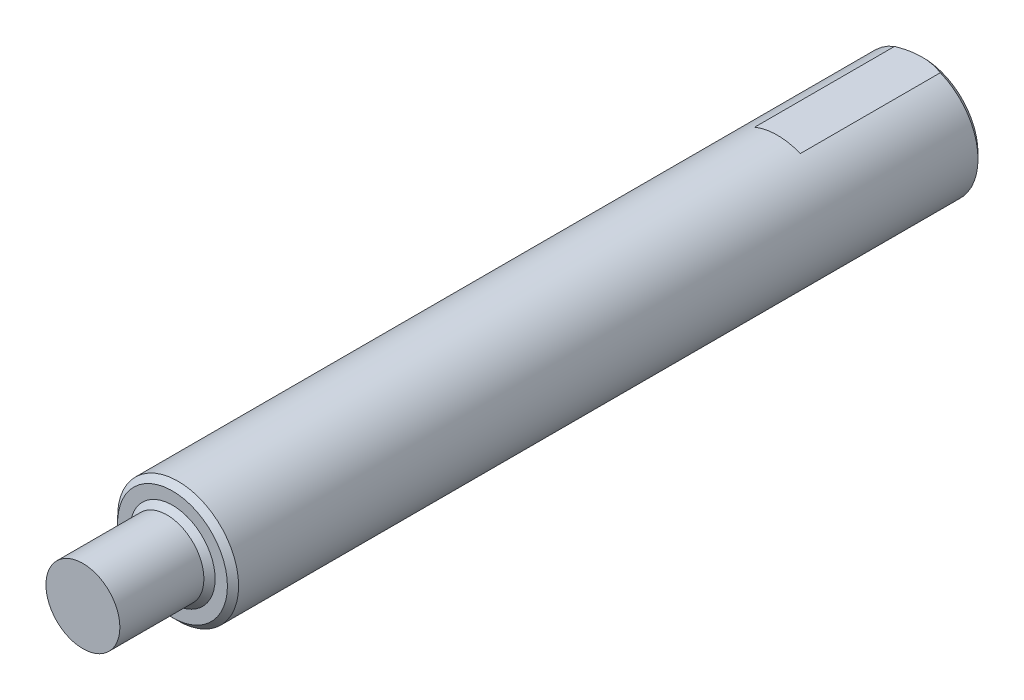
ISO-10303-21;
HEADER;
FILE_DESCRIPTION(('STEP AP214'),'2;1');
FILE_NAME('part.step','',(''),(''),'','','');
FILE_SCHEMA(('AUTOMOTIVE_DESIGN { 1 0 10303 214 1 1 1 1 }'));
ENDSEC;
DATA;
#1=APPLICATION_CONTEXT('core data for automotive mechanical design processes');
#2=APPLICATION_PROTOCOL_DEFINITION('international standard','automotive_design',2000,#1);
#3=PRODUCT_CONTEXT('',#1,'mechanical');
#4=PRODUCT('Part','Part','',(#3));
#5=PRODUCT_RELATED_PRODUCT_CATEGORY('part','',(#4));
#6=PRODUCT_DEFINITION_FORMATION('','',#4);
#7=PRODUCT_DEFINITION_CONTEXT('part definition',#1,'design');
#8=PRODUCT_DEFINITION('design','',#6,#7);
#9=PRODUCT_DEFINITION_SHAPE('','',#8);
#10=(LENGTH_UNIT() NAMED_UNIT(*) SI_UNIT(.MILLI.,.METRE.));
#11=(NAMED_UNIT(*) PLANE_ANGLE_UNIT() SI_UNIT($,.RADIAN.));
#12=(NAMED_UNIT(*) SI_UNIT($,.STERADIAN.) SOLID_ANGLE_UNIT());
#13=UNCERTAINTY_MEASURE_WITH_UNIT(LENGTH_MEASURE(1.E-05),#10,'distance_accuracy_value','');
#14=(GEOMETRIC_REPRESENTATION_CONTEXT(3) GLOBAL_UNCERTAINTY_ASSIGNED_CONTEXT((#13)) GLOBAL_UNIT_ASSIGNED_CONTEXT((#10,
#11,#12)) REPRESENTATION_CONTEXT('',''));
#15=CARTESIAN_POINT('',(0.,0.,0.));
#16=DIRECTION('',(0.,0.,1.));
#17=DIRECTION('',(1.,0.,0.));
#18=AXIS2_PLACEMENT_3D('',#15,#16,#17);
#19=CARTESIAN_POINT('',(0.,0.,67.));
#20=DIRECTION('',(0.,0.,-1.));
#21=DIRECTION('',(-1.,0.,0.));
#22=AXIS2_PLACEMENT_3D('',#19,#20,#21);
#23=CYLINDRICAL_SURFACE('',#22,5.4);
#24=CARTESIAN_POINT('',(0.,0.,66.5));
#25=DIRECTION('',(0.,0.,1.));
#26=DIRECTION('',(1.,0.,0.));
#27=AXIS2_PLACEMENT_3D('',#24,#25,#26);
#28=CIRCLE('',#27,5.4);
#29=CARTESIAN_POINT('',(5.4,0.,66.5));
#30=VERTEX_POINT('',#29);
#31=EDGE_CURVE('E114',#30,#30,#28,.F.);
#32=ORIENTED_EDGE('',*,*,#31,.T.);
#33=EDGE_LOOP('',(#32));
#34=FACE_BOUND('',#33,.T.);
#35=CARTESIAN_POINT('',(0.,0.,13.));
#36=DIRECTION('',(0.,0.,1.));
#37=DIRECTION('',(1.,0.,0.));
#38=AXIS2_PLACEMENT_3D('',#35,#36,#37);
#39=CIRCLE('',#38,5.4);
#40=CARTESIAN_POINT('',(-2.03960780543711,-5.,13.));
#41=VERTEX_POINT('',#40);
#42=CARTESIAN_POINT('',(2.03960780543711,-5.,13.));
#43=VERTEX_POINT('',#42);
#44=EDGE_CURVE('E86',#41,#43,#39,.T.);
#45=ORIENTED_EDGE('',*,*,#44,.T.);
#46=DIRECTION('',(0.,0.,-1.));
#47=VECTOR('',#46,1.);
#48=CARTESIAN_POINT('',(2.03960780543712,-5.,67.));
#49=LINE('',#48,#47);
#50=CARTESIAN_POINT('',(2.03960780543711,-5.,0.500000000000001));
#51=VERTEX_POINT('',#50);
#52=EDGE_CURVE('E92',#43,#51,#49,.T.);
#53=ORIENTED_EDGE('',*,*,#52,.T.);
#54=CARTESIAN_POINT('',(0.,0.,0.5));
#55=DIRECTION('',(0.,0.,1.));
#56=DIRECTION('',(1.,0.,0.));
#57=AXIS2_PLACEMENT_3D('',#54,#55,#56);
#58=CIRCLE('',#57,5.4);
#59=CARTESIAN_POINT('',(2.03960780543711,5.,0.5));
#60=VERTEX_POINT('',#59);
#61=EDGE_CURVE('E62',#51,#60,#58,.T.);
#62=ORIENTED_EDGE('',*,*,#61,.T.);
#63=DIRECTION('',(0.,0.,-1.));
#64=VECTOR('',#63,1.);
#65=CARTESIAN_POINT('',(2.03960780543712,5.,67.));
#66=LINE('',#65,#64);
#67=CARTESIAN_POINT('',(2.03960780543711,5.,13.));
#68=VERTEX_POINT('',#67);
#69=EDGE_CURVE('E106',#68,#60,#66,.T.);
#70=ORIENTED_EDGE('',*,*,#69,.F.);
#71=CARTESIAN_POINT('',(0.,0.,13.));
#72=DIRECTION('',(0.,0.,1.));
#73=DIRECTION('',(1.,0.,0.));
#74=AXIS2_PLACEMENT_3D('',#71,#72,#73);
#75=CIRCLE('',#74,5.4);
#76=CARTESIAN_POINT('',(-2.03960780543711,5.,13.));
#77=VERTEX_POINT('',#76);
#78=EDGE_CURVE('E139',#68,#77,#75,.T.);
#79=ORIENTED_EDGE('',*,*,#78,.T.);
#80=DIRECTION('',(0.,0.,-1.));
#81=VECTOR('',#80,1.);
#82=CARTESIAN_POINT('',(-2.03960780543712,5.,67.));
#83=LINE('',#82,#81);
#84=CARTESIAN_POINT('',(-2.03960780543711,5.,0.500000000000001));
#85=VERTEX_POINT('',#84);
#86=EDGE_CURVE('E104',#85,#77,#83,.F.);
#87=ORIENTED_EDGE('',*,*,#86,.F.);
#88=CARTESIAN_POINT('',(-2.03960780543711,-5.,0.5));
#89=VERTEX_POINT('',#88);
#90=EDGE_CURVE('E97',#85,#89,#58,.T.);
#91=ORIENTED_EDGE('',*,*,#90,.T.);
#92=DIRECTION('',(0.,0.,-1.));
#93=VECTOR('',#92,1.);
#94=CARTESIAN_POINT('',(-2.03960780543712,-5.,67.));
#95=LINE('',#94,#93);
#96=EDGE_CURVE('E54',#89,#41,#95,.F.);
#97=ORIENTED_EDGE('',*,*,#96,.T.);
#98=EDGE_LOOP('',(#45,#53,#62,#70,#79,#87,#91,#97));
#99=FACE_BOUND('',#98,.T.);
#100=ADVANCED_FACE('F39',(#34,#99),#23,.T.);
#101=CARTESIAN_POINT('',(0.,0.,0.5));
#102=DIRECTION('',(0.,0.,1.));
#103=DIRECTION('',(1.,0.,0.));
#104=AXIS2_PLACEMENT_3D('',#101,#102,#103);
#105=CONICAL_SURFACE('',#104,5.4,0.785398163397454);
#106=CARTESIAN_POINT('',(-3.55844793750584,-5.,1.23698229783494));
#107=CARTESIAN_POINT('',(-3.46862853281631,-5.,1.18490731578521));
#108=CARTESIAN_POINT('',(-3.37824708377923,-5.,1.13380360024076));
#109=CARTESIAN_POINT('',(-3.19623728614933,-5.,1.03381290104911));
#110=CARTESIAN_POINT('',(-3.10460862260932,-5.,0.984926491343643));
#111=CARTESIAN_POINT('',(-2.82702617390309,-5.,0.84167734532322));
#112=CARTESIAN_POINT('',(-2.63906658882333,-5.,0.75113053636076));
#113=CARTESIAN_POINT('',(-2.25426955084791,-5.,0.581916277053989));
#114=CARTESIAN_POINT('',(-2.05733888313538,-5.,0.503458458257276));
#115=CARTESIAN_POINT('',(-1.65751480131661,-5.,0.364256266708926));
#116=CARTESIAN_POINT('',(-1.4546319649387,-5.,0.303482344961021));
#117=CARTESIAN_POINT('',(-1.1246661128785,-5.,0.223502518929506));
#118=CARTESIAN_POINT('',(-0.999254136032923,-5.,0.197356244040855));
#119=CARTESIAN_POINT('',(-0.7468715711558,-5.,0.153946873610008));
#120=CARTESIAN_POINT('',(-0.619900907762321,-5.,0.136684209332923));
#121=CARTESIAN_POINT('',(-0.366074762066633,-5.,0.111805570168606));
#122=CARTESIAN_POINT('',(-0.239227094519324,-5.,0.104110605508209));
#123=CARTESIAN_POINT('',(0.0146882198085537,-5.,0.0984099621337332));
#124=CARTESIAN_POINT('',(0.141755871556905,-5.,0.100404505162543));
#125=CARTESIAN_POINT('',(0.414831894586559,-5.,0.115054400963581));
#126=CARTESIAN_POINT('',(0.560756443216524,-5.,0.129297800581304));
#127=CARTESIAN_POINT('',(0.850917867372856,-5.,0.169851883898826));
#128=CARTESIAN_POINT('',(0.995154397995772,-5.,0.196164991066865));
#129=CARTESIAN_POINT('',(1.28296336382972,-5.,0.260043725859941));
#130=CARTESIAN_POINT('',(1.42650538133625,-5.,0.297744851612287));
#131=CARTESIAN_POINT('',(1.71063388042911,-5.,0.382791524768694));
#132=CARTESIAN_POINT('',(1.85122096385269,-5.,0.430135086862981));
#133=CARTESIAN_POINT('',(2.17064155139047,-5.,0.548264489050556));
#134=CARTESIAN_POINT('',(2.34843963453479,-5.,0.62183722243253));
#135=CARTESIAN_POINT('',(2.69916966120003,-5.,0.779875127886671));
#136=CARTESIAN_POINT('',(2.87209891120536,-5.,0.864346190248952));
#137=CARTESIAN_POINT('',(3.2140915752397,-5.,1.04213553536569));
#138=CARTESIAN_POINT('',(3.38313912228285,-5.,1.13548410277971));
#139=CARTESIAN_POINT('',(3.71726244007848,-5.,1.32892384637747));
#140=CARTESIAN_POINT('',(3.88233894061287,-5.,1.42901377061601));
#141=CARTESIAN_POINT('',(4.20141944792188,-5.,1.62972307247471));
#142=CARTESIAN_POINT('',(4.35557911866465,-5.,1.73009626769987));
#143=CARTESIAN_POINT('',(4.66125946164198,-5.,1.93479801264585));
#144=CARTESIAN_POINT('',(4.81277991763847,-5.,2.03912688426204));
#145=CARTESIAN_POINT('',(5.11224654466357,-5.,2.25009416663372));
#146=CARTESIAN_POINT('',(5.26021226580976,-5.,2.35670492382208));
#147=CARTESIAN_POINT('',(5.5541632941286,-5.,2.57254212643726));
#148=CARTESIAN_POINT('',(5.7001491331678,-5.,2.68176784668037));
#149=CARTESIAN_POINT('',(5.84531484286481,-5.,2.79205470678773));
#150=B_SPLINE_CURVE_WITH_KNOTS('',3,(#106,#107,#108,#109,#110,#111,#112,#113,#114,#115,#116,
#117,#118,#119,#120,#121,#122,#123,#124,#125,#126,#127,#128,#129,#130,#131,#132,#133,#134,#135,
#136,#137,#138,#139,#140,#141,#142,#143,#144,#145,#146,#147,#148,#149),.UNSPECIFIED.,.F.,.F.,(4,
2,2,2,2,2,2,2,2,2,2,2,2,2,2,2,2,2,2,2,2,4),(0.,0.311458707648843,0.622997580473996,
1.24847571868561,1.88380812576863,2.51807274309483,2.90212477400918,3.28619544741344,
3.66707375996796,4.04796078890493,4.48726123245071,4.92664992146678,5.37148755985962,
5.81623370173474,6.39300615892292,6.97009166426407,7.54922173529127,8.12824455037756,
8.6800416751172,9.23188379943474,9.778969951991,10.3259061044888),.UNSPECIFIED.);
#151=EDGE_CURVE('E89',#89,#51,#150,.T.);
#152=ORIENTED_EDGE('',*,*,#151,.F.);
#153=ORIENTED_EDGE('',*,*,#90,.F.);
#154=CARTESIAN_POINT('',(-3.55844793750584,5.,1.23698229783494));
#155=CARTESIAN_POINT('',(-3.46862853281631,5.,1.18490731578521));
#156=CARTESIAN_POINT('',(-3.37824708377923,5.,1.13380360024076));
#157=CARTESIAN_POINT('',(-3.19623728614933,5.,1.03381290104911));
#158=CARTESIAN_POINT('',(-3.10460862260932,5.,0.984926491343643));
#159=CARTESIAN_POINT('',(-2.82702617390309,5.,0.84167734532322));
#160=CARTESIAN_POINT('',(-2.63906658882333,5.,0.75113053636076));
#161=CARTESIAN_POINT('',(-2.25426955084791,5.,0.581916277053989));
#162=CARTESIAN_POINT('',(-2.05733888313538,5.,0.503458458257276));
#163=CARTESIAN_POINT('',(-1.65751480131661,5.,0.364256266708926));
#164=CARTESIAN_POINT('',(-1.4546319649387,5.,0.303482344961021));
#165=CARTESIAN_POINT('',(-1.1246661128785,5.,0.223502518929506));
#166=CARTESIAN_POINT('',(-0.999254136032923,5.,0.197356244040855));
#167=CARTESIAN_POINT('',(-0.7468715711558,5.,0.153946873610008));
#168=CARTESIAN_POINT('',(-0.619900907762321,5.,0.136684209332923));
#169=CARTESIAN_POINT('',(-0.366074762066633,5.,0.111805570168606));
#170=CARTESIAN_POINT('',(-0.239227094519324,5.,0.104110605508209));
#171=CARTESIAN_POINT('',(0.0146882198085537,5.,0.0984099621337332));
#172=CARTESIAN_POINT('',(0.141755871556905,5.,0.100404505162543));
#173=CARTESIAN_POINT('',(0.414831894586559,5.,0.115054400963581));
#174=CARTESIAN_POINT('',(0.560756443216524,5.,0.129297800581304));
#175=CARTESIAN_POINT('',(0.850917867372856,5.,0.169851883898826));
#176=CARTESIAN_POINT('',(0.995154397995772,5.,0.196164991066865));
#177=CARTESIAN_POINT('',(1.28296336382972,5.,0.260043725859941));
#178=CARTESIAN_POINT('',(1.42650538133625,5.,0.297744851612287));
#179=CARTESIAN_POINT('',(1.71063388042911,5.,0.382791524768694));
#180=CARTESIAN_POINT('',(1.85122096385269,5.,0.430135086862981));
#181=CARTESIAN_POINT('',(2.17064155139047,5.,0.548264489050556));
#182=CARTESIAN_POINT('',(2.34843963453479,5.,0.62183722243253));
#183=CARTESIAN_POINT('',(2.69916966120003,5.,0.779875127886671));
#184=CARTESIAN_POINT('',(2.87209891120536,5.,0.864346190248952));
#185=CARTESIAN_POINT('',(3.2140915752397,5.,1.04213553536569));
#186=CARTESIAN_POINT('',(3.38313912228285,5.,1.13548410277971));
#187=CARTESIAN_POINT('',(3.71726244007848,5.,1.32892384637747));
#188=CARTESIAN_POINT('',(3.88233894061287,5.,1.42901377061601));
#189=CARTESIAN_POINT('',(4.20141944792188,5.,1.62972307247471));
#190=CARTESIAN_POINT('',(4.35557911866465,5.,1.73009626769987));
#191=CARTESIAN_POINT('',(4.66125946164198,5.,1.93479801264585));
#192=CARTESIAN_POINT('',(4.81277991763847,5.,2.03912688426204));
#193=CARTESIAN_POINT('',(5.11224654466357,5.,2.25009416663372));
#194=CARTESIAN_POINT('',(5.26021226580976,5.,2.35670492382208));
#195=CARTESIAN_POINT('',(5.5541632941286,5.,2.57254212643726));
#196=CARTESIAN_POINT('',(5.7001491331678,5.,2.68176784668037));
#197=CARTESIAN_POINT('',(5.84531484286481,5.,2.79205470678773));
#198=B_SPLINE_CURVE_WITH_KNOTS('',3,(#154,#155,#156,#157,#158,#159,#160,#161,#162,#163,#164,
#165,#166,#167,#168,#169,#170,#171,#172,#173,#174,#175,#176,#177,#178,#179,#180,#181,#182,#183,
#184,#185,#186,#187,#188,#189,#190,#191,#192,#193,#194,#195,#196,#197),.UNSPECIFIED.,.F.,.F.,(4,
2,2,2,2,2,2,2,2,2,2,2,2,2,2,2,2,2,2,2,2,4),(0.,0.311458707648843,0.622997580473996,
1.24847571868561,1.88380812576863,2.51807274309483,2.90212477400918,3.28619544741344,
3.66707375996796,4.04796078890493,4.48726123245071,4.92664992146678,5.37148755985962,
5.81623370173474,6.39300615892292,6.97009166426407,7.54922173529127,8.12824455037756,
8.6800416751172,9.23188379943474,9.778969951991,10.3259061044888),.UNSPECIFIED.);
#199=EDGE_CURVE('E130',#85,#60,#198,.T.);
#200=ORIENTED_EDGE('',*,*,#199,.T.);
#201=ORIENTED_EDGE('',*,*,#61,.F.);
#202=EDGE_LOOP('',(#152,#153,#200,#201));
#203=FACE_BOUND('',#202,.T.);
#204=CARTESIAN_POINT('',(0.,0.,0.));
#205=DIRECTION('',(0.,0.,1.));
#206=DIRECTION('',(1.,0.,0.));
#207=AXIS2_PLACEMENT_3D('',#204,#205,#206);
#208=CIRCLE('',#207,4.9);
#209=CARTESIAN_POINT('',(4.9,0.,0.));
#210=VERTEX_POINT('',#209);
#211=EDGE_CURVE('E118',#210,#210,#208,.F.);
#212=ORIENTED_EDGE('',*,*,#211,.F.);
#213=EDGE_LOOP('',(#212));
#214=FACE_BOUND('',#213,.T.);
#215=ADVANCED_FACE('F141',(#203,#214),#105,.T.);
#216=CARTESIAN_POINT('',(0.,0.,67.));
#217=DIRECTION('',(0.,0.,1.));
#218=DIRECTION('',(1.,0.,0.));
#219=AXIS2_PLACEMENT_3D('',#216,#217,#218);
#220=PLANE('',#219);
#221=CARTESIAN_POINT('',(0.,0.,67.));
#222=DIRECTION('',(0.,0.,1.));
#223=DIRECTION('',(1.,0.,0.));
#224=AXIS2_PLACEMENT_3D('',#221,#222,#223);
#225=CIRCLE('',#224,3.79999999999999);
#226=CARTESIAN_POINT('',(3.79999999999999,0.,67.));
#227=VERTEX_POINT('',#226);
#228=EDGE_CURVE('E11',#227,#227,#225,.F.);
#229=ORIENTED_EDGE('',*,*,#228,.T.);
#230=EDGE_LOOP('',(#229));
#231=FACE_BOUND('',#230,.T.);
#232=CARTESIAN_POINT('',(0.,0.,67.));
#233=DIRECTION('',(0.,0.,1.));
#234=DIRECTION('',(1.,0.,0.));
#235=AXIS2_PLACEMENT_3D('',#232,#233,#234);
#236=CIRCLE('',#235,4.89999999999999);
#237=CARTESIAN_POINT('',(4.89999999999999,0.,67.));
#238=VERTEX_POINT('',#237);
#239=EDGE_CURVE('E121',#238,#238,#236,.T.);
#240=ORIENTED_EDGE('',*,*,#239,.T.);
#241=EDGE_LOOP('',(#240));
#242=FACE_BOUND('',#241,.T.);
#243=ADVANCED_FACE('F171',(#231,#242),#220,.T.);
#244=CARTESIAN_POINT('',(0.,0.,0.));
#245=DIRECTION('',(0.,0.,1.));
#246=DIRECTION('',(1.,0.,0.));
#247=AXIS2_PLACEMENT_3D('',#244,#245,#246);
#248=PLANE('',#247);
#249=CARTESIAN_POINT('',(0.,0.,0.));
#250=DIRECTION('',(0.,0.,1.));
#251=DIRECTION('',(1.,0.,0.));
#252=AXIS2_PLACEMENT_3D('',#249,#250,#251);
#253=CIRCLE('',#252,2.6);
#254=CARTESIAN_POINT('',(2.6,0.,0.));
#255=VERTEX_POINT('',#254);
#256=EDGE_CURVE('E127',#255,#255,#253,.T.);
#257=ORIENTED_EDGE('',*,*,#256,.T.);
#258=EDGE_LOOP('',(#257));
#259=FACE_BOUND('',#258,.T.);
#260=ORIENTED_EDGE('',*,*,#211,.T.);
#261=EDGE_LOOP('',(#260));
#262=FACE_BOUND('',#261,.T.);
#263=ADVANCED_FACE('F174',(#259,#262),#248,.F.);
#264=CARTESIAN_POINT('',(0.,0.,67.));
#265=DIRECTION('',(0.,0.,-1.));
#266=DIRECTION('',(-1.,0.,0.));
#267=AXIS2_PLACEMENT_3D('',#264,#265,#266);
#268=CONICAL_SURFACE('',#267,4.89999999999999,0.785398163397447);
#269=ORIENTED_EDGE('',*,*,#31,.F.);
#270=EDGE_LOOP('',(#269));
#271=FACE_BOUND('',#270,.T.);
#272=ORIENTED_EDGE('',*,*,#239,.F.);
#273=EDGE_LOOP('',(#272));
#274=FACE_BOUND('',#273,.T.);
#275=ADVANCED_FACE('F169',(#271,#274),#268,.T.);
#276=CARTESIAN_POINT('',(0.,0.,75.));
#277=DIRECTION('',(0.,0.,-1.));
#278=DIRECTION('',(-1.,0.,0.));
#279=AXIS2_PLACEMENT_3D('',#276,#277,#278);
#280=CYLINDRICAL_SURFACE('',#279,3.3);
#281=CARTESIAN_POINT('',(0.,0.,67.5));
#282=DIRECTION('',(0.,0.,1.));
#283=DIRECTION('',(1.,0.,0.));
#284=AXIS2_PLACEMENT_3D('',#281,#282,#283);
#285=CIRCLE('',#284,3.3);
#286=CARTESIAN_POINT('',(3.3,0.,67.5));
#287=VERTEX_POINT('',#286);
#288=EDGE_CURVE('E47',#287,#287,#285,.T.);
#289=ORIENTED_EDGE('',*,*,#288,.T.);
#290=EDGE_LOOP('',(#289));
#291=FACE_BOUND('',#290,.T.);
#292=CARTESIAN_POINT('',(0.,0.,75.));
#293=DIRECTION('',(0.,0.,1.));
#294=DIRECTION('',(1.,0.,0.));
#295=AXIS2_PLACEMENT_3D('',#292,#293,#294);
#296=CIRCLE('',#295,3.3);
#297=CARTESIAN_POINT('',(3.3,0.,75.));
#298=VERTEX_POINT('',#297);
#299=EDGE_CURVE('E111',#298,#298,#296,.T.);
#300=ORIENTED_EDGE('',*,*,#299,.F.);
#301=EDGE_LOOP('',(#300));
#302=FACE_BOUND('',#301,.T.);
#303=ADVANCED_FACE('F165',(#291,#302),#280,.T.);
#304=CARTESIAN_POINT('',(0.,0.,75.));
#305=DIRECTION('',(0.,0.,1.));
#306=DIRECTION('',(1.,0.,0.));
#307=AXIS2_PLACEMENT_3D('',#304,#305,#306);
#308=PLANE('',#307);
#309=ORIENTED_EDGE('',*,*,#299,.T.);
#310=EDGE_LOOP('',(#309));
#311=FACE_BOUND('',#310,.T.);
#312=ADVANCED_FACE('F161',(#311),#308,.T.);
#313=CARTESIAN_POINT('',(0.,0.,12.4));
#314=DIRECTION('',(0.,0.,-1.));
#315=DIRECTION('',(-1.,0.,0.));
#316=AXIS2_PLACEMENT_3D('',#313,#314,#315);
#317=CONICAL_SURFACE('',#316,2.1,1.02974425867665);
#318=CARTESIAN_POINT('',(0.,0.,13.6618072999579));
#319=VERTEX_POINT('',#318);
#320=VERTEX_LOOP('',#319);
#321=FACE_BOUND('',#320,.T.);
#322=CARTESIAN_POINT('',(0.,0.,12.4));
#323=DIRECTION('',(0.,0.,-1.));
#324=DIRECTION('',(-1.,0.,0.));
#325=AXIS2_PLACEMENT_3D('',#322,#323,#324);
#326=CIRCLE('',#325,2.1);
#327=CARTESIAN_POINT('',(-2.1,0.,12.4));
#328=VERTEX_POINT('',#327);
#329=EDGE_CURVE('E108',#328,#328,#326,.T.);
#330=ORIENTED_EDGE('',*,*,#329,.T.);
#331=EDGE_LOOP('',(#330));
#332=FACE_BOUND('',#331,.T.);
#333=ADVANCED_FACE('F157',(#321,#332),#317,.F.);
#334=CARTESIAN_POINT('',(0.,0.,0.));
#335=DIRECTION('',(0.,0.,-1.));
#336=DIRECTION('',(-1.,0.,0.));
#337=AXIS2_PLACEMENT_3D('',#334,#335,#336);
#338=CYLINDRICAL_SURFACE('',#337,2.1);
#339=CARTESIAN_POINT('',(0.,0.,0.499999999999993));
#340=DIRECTION('',(0.,0.,1.));
#341=DIRECTION('',(1.,0.,0.));
#342=AXIS2_PLACEMENT_3D('',#339,#340,#341);
#343=CIRCLE('',#342,2.1);
#344=CARTESIAN_POINT('',(2.1,0.,0.499999999999993));
#345=VERTEX_POINT('',#344);
#346=EDGE_CURVE('E124',#345,#345,#343,.F.);
#347=ORIENTED_EDGE('',*,*,#346,.T.);
#348=EDGE_LOOP('',(#347));
#349=FACE_BOUND('',#348,.T.);
#350=ORIENTED_EDGE('',*,*,#329,.F.);
#351=EDGE_LOOP('',(#350));
#352=FACE_BOUND('',#351,.T.);
#353=ADVANCED_FACE('F153',(#349,#352),#338,.F.);
#354=CARTESIAN_POINT('',(0.,0.,0.499999999999993));
#355=DIRECTION('',(0.,0.,-1.));
#356=DIRECTION('',(-1.,0.,0.));
#357=AXIS2_PLACEMENT_3D('',#354,#355,#356);
#358=CONICAL_SURFACE('',#357,2.1,0.785398163397455);
#359=ORIENTED_EDGE('',*,*,#256,.F.);
#360=EDGE_LOOP('',(#359));
#361=FACE_BOUND('',#360,.T.);
#362=ORIENTED_EDGE('',*,*,#346,.F.);
#363=EDGE_LOOP('',(#362));
#364=FACE_BOUND('',#363,.T.);
#365=ADVANCED_FACE('F156',(#361,#364),#358,.F.);
#366=CARTESIAN_POINT('',(-5.,5.,13.));
#367=DIRECTION('',(0.,0.,1.));
#368=DIRECTION('',(1.,0.,0.));
#369=AXIS2_PLACEMENT_3D('',#366,#367,#368);
#370=PLANE('',#369);
#371=DIRECTION('',(1.,0.,0.));
#372=VECTOR('',#371,1.);
#373=CARTESIAN_POINT('',(-5.,5.,13.));
#374=LINE('',#373,#372);
#375=EDGE_CURVE('E99',#77,#68,#374,.T.);
#376=ORIENTED_EDGE('',*,*,#375,.F.);
#377=ORIENTED_EDGE('',*,*,#78,.F.);
#378=EDGE_LOOP('',(#376,#377));
#379=FACE_BOUND('',#378,.T.);
#380=ADVANCED_FACE('F150',(#379),#370,.F.);
#381=CARTESIAN_POINT('',(-5.,5.,13.));
#382=DIRECTION('',(0.,1.,0.));
#383=DIRECTION('',(0.,0.,1.));
#384=AXIS2_PLACEMENT_3D('',#381,#382,#383);
#385=PLANE('',#384);
#386=ORIENTED_EDGE('',*,*,#69,.T.);
#387=ORIENTED_EDGE('',*,*,#199,.F.);
#388=ORIENTED_EDGE('',*,*,#86,.T.);
#389=ORIENTED_EDGE('',*,*,#375,.T.);
#390=EDGE_LOOP('',(#386,#387,#388,#389));
#391=FACE_BOUND('',#390,.T.);
#392=ADVANCED_FACE('F145',(#391),#385,.T.);
#393=CARTESIAN_POINT('',(-5.,-5.,13.));
#394=DIRECTION('',(0.,0.,1.));
#395=DIRECTION('',(1.,0.,0.));
#396=AXIS2_PLACEMENT_3D('',#393,#394,#395);
#397=PLANE('',#396);
#398=DIRECTION('',(1.,0.,0.));
#399=VECTOR('',#398,1.);
#400=CARTESIAN_POINT('',(-5.,-5.,13.));
#401=LINE('',#400,#399);
#402=EDGE_CURVE('E88',#41,#43,#401,.T.);
#403=ORIENTED_EDGE('',*,*,#402,.T.);
#404=ORIENTED_EDGE('',*,*,#44,.F.);
#405=EDGE_LOOP('',(#403,#404));
#406=FACE_BOUND('',#405,.T.);
#407=ADVANCED_FACE('F87',(#406),#397,.F.);
#408=CARTESIAN_POINT('',(-5.,-5.,13.));
#409=DIRECTION('',(0.,1.,0.));
#410=DIRECTION('',(0.,0.,1.));
#411=AXIS2_PLACEMENT_3D('',#408,#409,#410);
#412=PLANE('',#411);
#413=ORIENTED_EDGE('',*,*,#402,.F.);
#414=ORIENTED_EDGE('',*,*,#96,.F.);
#415=ORIENTED_EDGE('',*,*,#151,.T.);
#416=ORIENTED_EDGE('',*,*,#52,.F.);
#417=EDGE_LOOP('',(#413,#414,#415,#416));
#418=FACE_BOUND('',#417,.T.);
#419=ADVANCED_FACE('F91',(#418),#412,.F.);
#420=CARTESIAN_POINT('',(0.,0.,67.5));
#421=DIRECTION('',(0.,0.,-1.));
#422=DIRECTION('',(-1.,0.,0.));
#423=AXIS2_PLACEMENT_3D('',#420,#421,#422);
#424=CONICAL_SURFACE('',#423,3.3,0.785398163397438);
#425=ORIENTED_EDGE('',*,*,#228,.F.);
#426=EDGE_LOOP('',(#425));
#427=FACE_BOUND('',#426,.T.);
#428=ORIENTED_EDGE('',*,*,#288,.F.);
#429=EDGE_LOOP('',(#428));
#430=FACE_BOUND('',#429,.T.);
#431=ADVANCED_FACE('F41',(#427,#430),#424,.T.);
#432=CLOSED_SHELL('',(#100,#215,#243,#263,#275,#303,#312,#333,#353,#365,#380,#392,#407,#419,#431));
#433=MANIFOLD_SOLID_BREP('B2',#432);
#434=ADVANCED_BREP_SHAPE_REPRESENTATION('',(#18,#433),#14);
#435=SHAPE_DEFINITION_REPRESENTATION(#9,#434);
ENDSEC;
END-ISO-10303-21;
